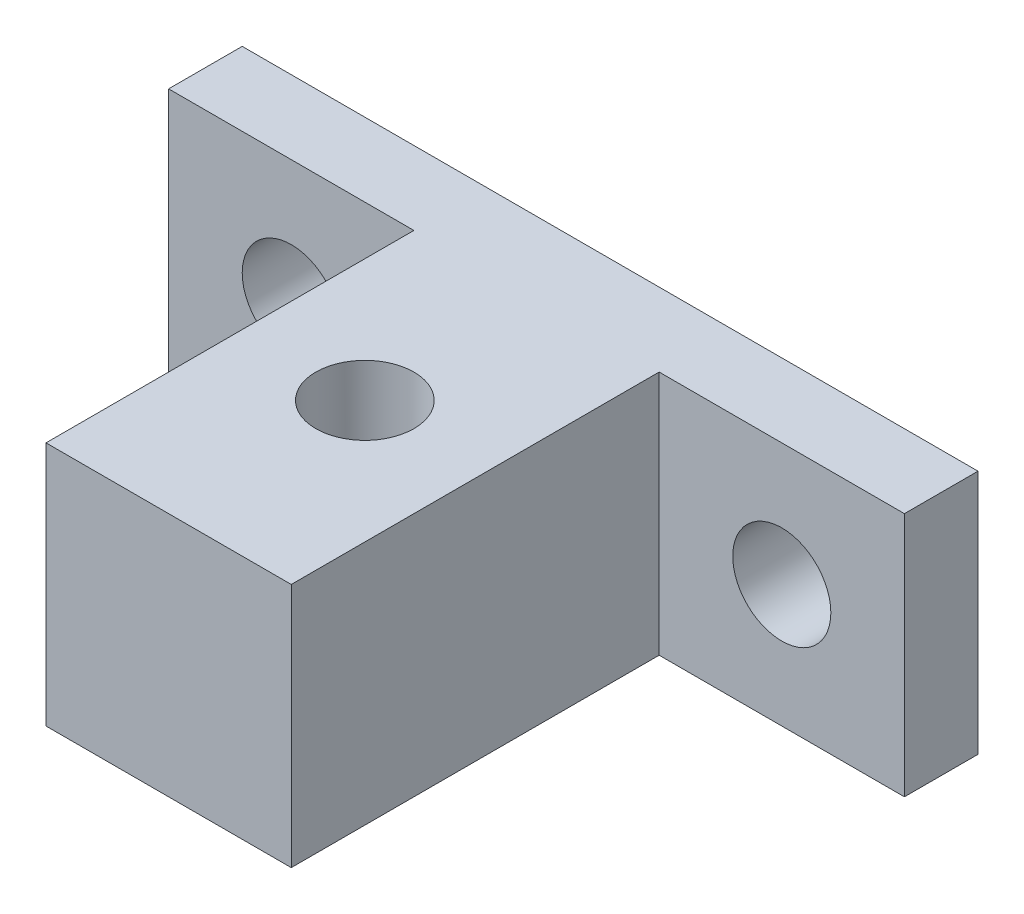
ISO-10303-21;
HEADER;
FILE_DESCRIPTION(('STEP AP214'),'2;1');
FILE_NAME('part.step','',(''),(''),'','','');
FILE_SCHEMA(('AUTOMOTIVE_DESIGN { 1 0 10303 214 1 1 1 1 }'));
ENDSEC;
DATA;
#1=APPLICATION_CONTEXT('core data for automotive mechanical design processes');
#2=APPLICATION_PROTOCOL_DEFINITION('international standard','automotive_design',2000,#1);
#3=PRODUCT_CONTEXT('',#1,'mechanical');
#4=PRODUCT('Part','Part','',(#3));
#5=PRODUCT_RELATED_PRODUCT_CATEGORY('part','',(#4));
#6=PRODUCT_DEFINITION_FORMATION('','',#4);
#7=PRODUCT_DEFINITION_CONTEXT('part definition',#1,'design');
#8=PRODUCT_DEFINITION('design','',#6,#7);
#9=PRODUCT_DEFINITION_SHAPE('','',#8);
#10=(LENGTH_UNIT() NAMED_UNIT(*) SI_UNIT(.MILLI.,.METRE.));
#11=(NAMED_UNIT(*) PLANE_ANGLE_UNIT() SI_UNIT($,.RADIAN.));
#12=(NAMED_UNIT(*) SI_UNIT($,.STERADIAN.) SOLID_ANGLE_UNIT());
#13=UNCERTAINTY_MEASURE_WITH_UNIT(LENGTH_MEASURE(1.E-05),#10,'distance_accuracy_value','');
#14=(GEOMETRIC_REPRESENTATION_CONTEXT(3) GLOBAL_UNCERTAINTY_ASSIGNED_CONTEXT((#13)) GLOBAL_UNIT_ASSIGNED_CONTEXT((#10,
#11,#12)) REPRESENTATION_CONTEXT('',''));
#15=CARTESIAN_POINT('',(0.,0.,0.));
#16=DIRECTION('',(0.,0.,1.));
#17=DIRECTION('',(1.,0.,0.));
#18=AXIS2_PLACEMENT_3D('',#15,#16,#17);
#19=CARTESIAN_POINT('',(0.,0.,3.));
#20=DIRECTION('',(0.,0.,-1.));
#21=DIRECTION('',(-1.,0.,0.));
#22=AXIS2_PLACEMENT_3D('',#19,#20,#21);
#23=PLANE('',#22);
#24=CARTESIAN_POINT('',(20.,-8.30000000000009,3.));
#25=DIRECTION('',(0.,0.,1.));
#26=DIRECTION('',(1.,0.,0.));
#27=AXIS2_PLACEMENT_3D('',#24,#25,#26);
#28=CIRCLE('',#27,2.);
#29=CARTESIAN_POINT('',(22.,-8.30000000000009,3.));
#30=VERTEX_POINT('',#29);
#31=EDGE_CURVE('E195',#30,#30,#28,.T.);
#32=ORIENTED_EDGE('',*,*,#31,.F.);
#33=EDGE_LOOP('',(#32));
#34=FACE_BOUND('',#33,.T.);
#35=DIRECTION('',(0.,1.,0.));
#36=VECTOR('',#35,1.);
#37=CARTESIAN_POINT('',(15.,-3.30000000000009,3.));
#38=LINE('',#37,#36);
#39=CARTESIAN_POINT('',(15.,-13.3000000000001,3.));
#40=VERTEX_POINT('',#39);
#41=CARTESIAN_POINT('',(15.,-3.30000000000009,3.));
#42=VERTEX_POINT('',#41);
#43=EDGE_CURVE('E57',#40,#42,#38,.T.);
#44=ORIENTED_EDGE('',*,*,#43,.F.);
#45=DIRECTION('',(1.,0.,0.));
#46=VECTOR('',#45,1.);
#47=CARTESIAN_POINT('',(25.,-13.3000000000001,3.));
#48=LINE('',#47,#46);
#49=CARTESIAN_POINT('',(25.,-13.3000000000001,3.));
#50=VERTEX_POINT('',#49);
#51=EDGE_CURVE('E210',#40,#50,#48,.T.);
#52=ORIENTED_EDGE('',*,*,#51,.T.);
#53=DIRECTION('',(0.,1.,0.));
#54=VECTOR('',#53,1.);
#55=CARTESIAN_POINT('',(25.,-3.30000000000009,3.));
#56=LINE('',#55,#54);
#57=CARTESIAN_POINT('',(25.,-3.30000000000009,3.));
#58=VERTEX_POINT('',#57);
#59=EDGE_CURVE('E201',#50,#58,#56,.T.);
#60=ORIENTED_EDGE('',*,*,#59,.T.);
#61=DIRECTION('',(-1.,0.,0.));
#62=VECTOR('',#61,1.);
#63=CARTESIAN_POINT('',(25.,-3.30000000000009,3.));
#64=LINE('',#63,#62);
#65=EDGE_CURVE('E206',#58,#42,#64,.T.);
#66=ORIENTED_EDGE('',*,*,#65,.T.);
#67=EDGE_LOOP('',(#44,#52,#60,#66));
#68=FACE_BOUND('',#67,.T.);
#69=ADVANCED_FACE('F34',(#34,#68),#23,.F.);
#70=CARTESIAN_POINT('',(0.,-8.30000000000009,3.));
#71=DIRECTION('',(0.,0.,1.));
#72=DIRECTION('',(-1.,0.,0.));
#73=AXIS2_PLACEMENT_3D('',#70,#71,#72);
#74=CIRCLE('',#73,2.);
#75=CARTESIAN_POINT('',(-2.,-8.30000000000009,3.));
#76=VERTEX_POINT('',#75);
#77=EDGE_CURVE('E189',#76,#76,#74,.T.);
#78=ORIENTED_EDGE('',*,*,#77,.F.);
#79=EDGE_LOOP('',(#78));
#80=FACE_BOUND('',#79,.T.);
#81=DIRECTION('',(0.,-1.,0.));
#82=VECTOR('',#81,1.);
#83=CARTESIAN_POINT('',(5.,-3.30000000000009,3.));
#84=LINE('',#83,#82);
#85=CARTESIAN_POINT('',(5.,-3.30000000000009,3.));
#86=VERTEX_POINT('',#85);
#87=CARTESIAN_POINT('',(5.00000000000001,-13.3000000000001,3.));
#88=VERTEX_POINT('',#87);
#89=EDGE_CURVE('E159',#86,#88,#84,.T.);
#90=ORIENTED_EDGE('',*,*,#89,.F.);
#91=CARTESIAN_POINT('',(-5.,-3.30000000000009,3.));
#92=VERTEX_POINT('',#91);
#93=EDGE_CURVE('E204',#86,#92,#64,.T.);
#94=ORIENTED_EDGE('',*,*,#93,.T.);
#95=DIRECTION('',(0.,-1.,0.));
#96=VECTOR('',#95,1.);
#97=CARTESIAN_POINT('',(-5.,-3.30000000000009,3.));
#98=LINE('',#97,#96);
#99=CARTESIAN_POINT('',(-5.,-13.3000000000001,3.));
#100=VERTEX_POINT('',#99);
#101=EDGE_CURVE('E208',#92,#100,#98,.T.);
#102=ORIENTED_EDGE('',*,*,#101,.T.);
#103=EDGE_CURVE('E211',#100,#88,#48,.T.);
#104=ORIENTED_EDGE('',*,*,#103,.T.);
#105=EDGE_LOOP('',(#90,#94,#102,#104));
#106=FACE_BOUND('',#105,.T.);
#107=ADVANCED_FACE('F260',(#80,#106),#23,.F.);
#108=CARTESIAN_POINT('',(0.,0.,0.));
#109=DIRECTION('',(0.,0.,-1.));
#110=DIRECTION('',(-1.,0.,0.));
#111=AXIS2_PLACEMENT_3D('',#108,#109,#110);
#112=PLANE('',#111);
#113=CARTESIAN_POINT('',(20.,-8.30000000000009,0.));
#114=DIRECTION('',(0.,0.,1.));
#115=DIRECTION('',(1.,0.,0.));
#116=AXIS2_PLACEMENT_3D('',#113,#114,#115);
#117=CIRCLE('',#116,2.);
#118=CARTESIAN_POINT('',(22.,-8.30000000000009,0.));
#119=VERTEX_POINT('',#118);
#120=EDGE_CURVE('E192',#119,#119,#117,.T.);
#121=ORIENTED_EDGE('',*,*,#120,.T.);
#122=EDGE_LOOP('',(#121));
#123=FACE_BOUND('',#122,.T.);
#124=DIRECTION('',(0.,1.,0.));
#125=VECTOR('',#124,1.);
#126=CARTESIAN_POINT('',(25.,-3.30000000000009,0.));
#127=LINE('',#126,#125);
#128=CARTESIAN_POINT('',(25.,-13.3000000000001,0.));
#129=VERTEX_POINT('',#128);
#130=CARTESIAN_POINT('',(25.,-3.30000000000009,0.));
#131=VERTEX_POINT('',#130);
#132=EDGE_CURVE('E198',#129,#131,#127,.T.);
#133=ORIENTED_EDGE('',*,*,#132,.F.);
#134=DIRECTION('',(1.,0.,0.));
#135=VECTOR('',#134,1.);
#136=CARTESIAN_POINT('',(25.,-13.3000000000001,0.));
#137=LINE('',#136,#135);
#138=CARTESIAN_POINT('',(-5.,-13.3000000000001,0.));
#139=VERTEX_POINT('',#138);
#140=EDGE_CURVE('E205',#139,#129,#137,.T.);
#141=ORIENTED_EDGE('',*,*,#140,.F.);
#142=DIRECTION('',(0.,-1.,0.));
#143=VECTOR('',#142,1.);
#144=CARTESIAN_POINT('',(-5.,-3.30000000000009,0.));
#145=LINE('',#144,#143);
#146=CARTESIAN_POINT('',(-5.,-3.30000000000009,0.));
#147=VERTEX_POINT('',#146);
#148=EDGE_CURVE('E218',#147,#139,#145,.T.);
#149=ORIENTED_EDGE('',*,*,#148,.F.);
#150=DIRECTION('',(-1.,0.,0.));
#151=VECTOR('',#150,1.);
#152=CARTESIAN_POINT('',(25.,-3.30000000000009,0.));
#153=LINE('',#152,#151);
#154=EDGE_CURVE('E216',#131,#147,#153,.T.);
#155=ORIENTED_EDGE('',*,*,#154,.F.);
#156=EDGE_LOOP('',(#133,#141,#149,#155));
#157=FACE_BOUND('',#156,.T.);
#158=CARTESIAN_POINT('',(0.,-8.30000000000009,0.));
#159=DIRECTION('',(0.,0.,1.));
#160=DIRECTION('',(-1.,0.,0.));
#161=AXIS2_PLACEMENT_3D('',#158,#159,#160);
#162=CIRCLE('',#161,2.);
#163=CARTESIAN_POINT('',(-2.,-8.30000000000009,0.));
#164=VERTEX_POINT('',#163);
#165=EDGE_CURVE('E188',#164,#164,#162,.T.);
#166=ORIENTED_EDGE('',*,*,#165,.T.);
#167=EDGE_LOOP('',(#166));
#168=FACE_BOUND('',#167,.T.);
#169=ADVANCED_FACE('F237',(#123,#157,#168),#112,.T.);
#170=CARTESIAN_POINT('',(25.,-3.30000000000009,3.));
#171=DIRECTION('',(-1.,0.,0.));
#172=DIRECTION('',(0.,0.,1.));
#173=AXIS2_PLACEMENT_3D('',#170,#171,#172);
#174=PLANE('',#173);
#175=ORIENTED_EDGE('',*,*,#132,.T.);
#176=DIRECTION('',(0.,0.,-1.));
#177=VECTOR('',#176,1.);
#178=CARTESIAN_POINT('',(25.,-3.30000000000009,3.));
#179=LINE('',#178,#177);
#180=EDGE_CURVE('E11',#58,#131,#179,.T.);
#181=ORIENTED_EDGE('',*,*,#180,.F.);
#182=ORIENTED_EDGE('',*,*,#59,.F.);
#183=DIRECTION('',(0.,0.,-1.));
#184=VECTOR('',#183,1.);
#185=CARTESIAN_POINT('',(25.,-13.3000000000001,3.));
#186=LINE('',#185,#184);
#187=EDGE_CURVE('E213',#50,#129,#186,.T.);
#188=ORIENTED_EDGE('',*,*,#187,.T.);
#189=EDGE_LOOP('',(#175,#181,#182,#188));
#190=FACE_BOUND('',#189,.T.);
#191=ADVANCED_FACE('F36',(#190),#174,.F.);
#192=CARTESIAN_POINT('',(25.,-3.30000000000009,3.));
#193=DIRECTION('',(0.,-1.,0.));
#194=DIRECTION('',(0.,0.,-1.));
#195=AXIS2_PLACEMENT_3D('',#192,#193,#194);
#196=PLANE('',#195);
#197=CARTESIAN_POINT('',(10.,-3.30000000000009,10.));
#198=DIRECTION('',(0.,-1.,0.));
#199=DIRECTION('',(0.,0.,-1.));
#200=AXIS2_PLACEMENT_3D('',#197,#198,#199);
#201=CIRCLE('',#200,2.);
#202=CARTESIAN_POINT('',(10.,-3.30000000000009,8.));
#203=VERTEX_POINT('',#202);
#204=EDGE_CURVE('E296',#203,#203,#201,.T.);
#205=ORIENTED_EDGE('',*,*,#204,.T.);
#206=EDGE_LOOP('',(#205));
#207=FACE_BOUND('',#206,.T.);
#208=ORIENTED_EDGE('',*,*,#154,.T.);
#209=DIRECTION('',(0.,0.,-1.));
#210=VECTOR('',#209,1.);
#211=CARTESIAN_POINT('',(-5.,-3.30000000000009,3.));
#212=LINE('',#211,#210);
#213=EDGE_CURVE('E42',#92,#147,#212,.T.);
#214=ORIENTED_EDGE('',*,*,#213,.F.);
#215=ORIENTED_EDGE('',*,*,#93,.F.);
#216=DIRECTION('',(0.,0.,-1.));
#217=VECTOR('',#216,1.);
#218=CARTESIAN_POINT('',(5.,-3.30000000000009,18.));
#219=LINE('',#218,#217);
#220=CARTESIAN_POINT('',(5.,-3.30000000000009,18.));
#221=VERTEX_POINT('',#220);
#222=EDGE_CURVE('E182',#221,#86,#219,.T.);
#223=ORIENTED_EDGE('',*,*,#222,.F.);
#224=DIRECTION('',(-1.,0.,0.));
#225=VECTOR('',#224,1.);
#226=CARTESIAN_POINT('',(15.,-3.30000000000009,18.));
#227=LINE('',#226,#225);
#228=CARTESIAN_POINT('',(15.,-3.30000000000009,18.));
#229=VERTEX_POINT('',#228);
#230=EDGE_CURVE('E168',#229,#221,#227,.T.);
#231=ORIENTED_EDGE('',*,*,#230,.F.);
#232=DIRECTION('',(0.,0.,-1.));
#233=VECTOR('',#232,1.);
#234=CARTESIAN_POINT('',(15.,-3.30000000000009,18.));
#235=LINE('',#234,#233);
#236=EDGE_CURVE('E185',#229,#42,#235,.T.);
#237=ORIENTED_EDGE('',*,*,#236,.T.);
#238=ORIENTED_EDGE('',*,*,#65,.F.);
#239=ORIENTED_EDGE('',*,*,#180,.T.);
#240=EDGE_LOOP('',(#208,#214,#215,#223,#231,#237,#238,#239));
#241=FACE_BOUND('',#240,.T.);
#242=ADVANCED_FACE('F261',(#207,#241),#196,.F.);
#243=CARTESIAN_POINT('',(-5.,-3.30000000000009,3.));
#244=DIRECTION('',(1.,0.,0.));
#245=DIRECTION('',(0.,0.,-1.));
#246=AXIS2_PLACEMENT_3D('',#243,#244,#245);
#247=PLANE('',#246);
#248=ORIENTED_EDGE('',*,*,#148,.T.);
#249=DIRECTION('',(0.,0.,-1.));
#250=VECTOR('',#249,1.);
#251=CARTESIAN_POINT('',(-5.,-13.3000000000001,3.));
#252=LINE('',#251,#250);
#253=EDGE_CURVE('E223',#100,#139,#252,.T.);
#254=ORIENTED_EDGE('',*,*,#253,.F.);
#255=ORIENTED_EDGE('',*,*,#101,.F.);
#256=ORIENTED_EDGE('',*,*,#213,.T.);
#257=EDGE_LOOP('',(#248,#254,#255,#256));
#258=FACE_BOUND('',#257,.T.);
#259=ADVANCED_FACE('F230',(#258),#247,.F.);
#260=CARTESIAN_POINT('',(25.,-13.3000000000001,3.));
#261=DIRECTION('',(0.,1.,0.));
#262=DIRECTION('',(0.,0.,1.));
#263=AXIS2_PLACEMENT_3D('',#260,#261,#262);
#264=PLANE('',#263);
#265=DIRECTION('',(-0.866025403784439,0.,-0.5));
#266=VECTOR('',#265,1.);
#267=CARTESIAN_POINT('',(19.9189110867545,-13.3000000000001,11.8007041555162));
#268=LINE('',#267,#266);
#269=CARTESIAN_POINT('',(13.4,-13.3000000000001,8.03700908475527));
#270=VERTEX_POINT('',#269);
#271=CARTESIAN_POINT('',(10.,-13.3000000000001,6.07401816951054));
#272=VERTEX_POINT('',#271);
#273=EDGE_CURVE('E49',#270,#272,#268,.T.);
#274=ORIENTED_EDGE('',*,*,#273,.T.);
#275=DIRECTION('',(-0.866025403784439,0.,0.5));
#276=VECTOR('',#275,1.);
#277=CARTESIAN_POINT('',(22.5810889132455,-13.3000000000001,-1.18967690125038));
#278=LINE('',#277,#276);
#279=CARTESIAN_POINT('',(6.60000000000001,-13.3000000000001,8.03700908475527));
#280=VERTEX_POINT('',#279);
#281=EDGE_CURVE('E156',#272,#280,#278,.T.);
#282=ORIENTED_EDGE('',*,*,#281,.T.);
#283=DIRECTION('',(0.,0.,1.));
#284=VECTOR('',#283,1.);
#285=CARTESIAN_POINT('',(6.60000000000001,-13.3000000000001,3.));
#286=LINE('',#285,#284);
#287=CARTESIAN_POINT('',(6.60000000000001,-13.3000000000001,11.9629909152447));
#288=VERTEX_POINT('',#287);
#289=EDGE_CURVE('E298',#280,#288,#286,.T.);
#290=ORIENTED_EDGE('',*,*,#289,.T.);
#291=DIRECTION('',(0.866025403784439,0.,0.5));
#292=VECTOR('',#291,1.);
#293=CARTESIAN_POINT('',(16.5189110867545,-13.3000000000001,17.6896769012504));
#294=LINE('',#293,#292);
#295=CARTESIAN_POINT('',(10.,-13.3000000000001,13.9259818304895));
#296=VERTEX_POINT('',#295);
#297=EDGE_CURVE('E307',#288,#296,#294,.T.);
#298=ORIENTED_EDGE('',*,*,#297,.T.);
#299=DIRECTION('',(0.866025403784439,0.,-0.5));
#300=VECTOR('',#299,1.);
#301=CARTESIAN_POINT('',(25.9810889132455,-13.3000000000001,4.69929584448381));
#302=LINE('',#301,#300);
#303=CARTESIAN_POINT('',(13.4,-13.3000000000001,11.9629909152447));
#304=VERTEX_POINT('',#303);
#305=EDGE_CURVE('E310',#296,#304,#302,.T.);
#306=ORIENTED_EDGE('',*,*,#305,.T.);
#307=DIRECTION('',(0.,0.,-1.));
#308=VECTOR('',#307,1.);
#309=CARTESIAN_POINT('',(13.4,-13.3000000000001,3.));
#310=LINE('',#309,#308);
#311=EDGE_CURVE('E152',#304,#270,#310,.T.);
#312=ORIENTED_EDGE('',*,*,#311,.T.);
#313=EDGE_LOOP('',(#274,#282,#290,#298,#306,#312));
#314=FACE_BOUND('',#313,.T.);
#315=ORIENTED_EDGE('',*,*,#140,.T.);
#316=ORIENTED_EDGE('',*,*,#187,.F.);
#317=ORIENTED_EDGE('',*,*,#51,.F.);
#318=DIRECTION('',(0.,0.,-1.));
#319=VECTOR('',#318,1.);
#320=CARTESIAN_POINT('',(15.,-13.3000000000001,18.));
#321=LINE('',#320,#319);
#322=CARTESIAN_POINT('',(15.,-13.3000000000001,18.));
#323=VERTEX_POINT('',#322);
#324=EDGE_CURVE('E173',#323,#40,#321,.T.);
#325=ORIENTED_EDGE('',*,*,#324,.F.);
#326=DIRECTION('',(1.,0.,0.));
#327=VECTOR('',#326,1.);
#328=CARTESIAN_POINT('',(15.,-13.3000000000001,18.));
#329=LINE('',#328,#327);
#330=CARTESIAN_POINT('',(5.00000000000001,-13.3000000000001,18.));
#331=VERTEX_POINT('',#330);
#332=EDGE_CURVE('E172',#331,#323,#329,.T.);
#333=ORIENTED_EDGE('',*,*,#332,.F.);
#334=DIRECTION('',(0.,0.,-1.));
#335=VECTOR('',#334,1.);
#336=CARTESIAN_POINT('',(5.00000000000001,-13.3000000000001,18.));
#337=LINE('',#336,#335);
#338=EDGE_CURVE('E179',#331,#88,#337,.T.);
#339=ORIENTED_EDGE('',*,*,#338,.T.);
#340=ORIENTED_EDGE('',*,*,#103,.F.);
#341=ORIENTED_EDGE('',*,*,#253,.T.);
#342=EDGE_LOOP('',(#315,#316,#317,#325,#333,#339,#340,#341));
#343=FACE_BOUND('',#342,.T.);
#344=ADVANCED_FACE('F241',(#314,#343),#264,.F.);
#345=CARTESIAN_POINT('',(20.,-8.30000000000009,3.));
#346=DIRECTION('',(0.,0.,-1.));
#347=DIRECTION('',(-1.,0.,0.));
#348=AXIS2_PLACEMENT_3D('',#345,#346,#347);
#349=CYLINDRICAL_SURFACE('',#348,2.);
#350=ORIENTED_EDGE('',*,*,#31,.T.);
#351=EDGE_LOOP('',(#350));
#352=FACE_BOUND('',#351,.T.);
#353=ORIENTED_EDGE('',*,*,#120,.F.);
#354=EDGE_LOOP('',(#353));
#355=FACE_BOUND('',#354,.T.);
#356=ADVANCED_FACE('F280',(#352,#355),#349,.F.);
#357=CARTESIAN_POINT('',(0.,-8.30000000000009,3.));
#358=DIRECTION('',(0.,0.,-1.));
#359=DIRECTION('',(-1.,0.,0.));
#360=AXIS2_PLACEMENT_3D('',#357,#358,#359);
#361=CYLINDRICAL_SURFACE('',#360,2.);
#362=ORIENTED_EDGE('',*,*,#77,.T.);
#363=EDGE_LOOP('',(#362));
#364=FACE_BOUND('',#363,.T.);
#365=ORIENTED_EDGE('',*,*,#165,.F.);
#366=EDGE_LOOP('',(#365));
#367=FACE_BOUND('',#366,.T.);
#368=ADVANCED_FACE('F290',(#364,#367),#361,.F.);
#369=CARTESIAN_POINT('',(15.,-3.30000000000009,18.));
#370=DIRECTION('',(-1.,0.,0.));
#371=DIRECTION('',(0.,-1.,0.));
#372=AXIS2_PLACEMENT_3D('',#369,#370,#371);
#373=PLANE('',#372);
#374=ORIENTED_EDGE('',*,*,#43,.T.);
#375=ORIENTED_EDGE('',*,*,#236,.F.);
#376=DIRECTION('',(0.,1.,0.));
#377=VECTOR('',#376,1.);
#378=CARTESIAN_POINT('',(15.,-3.30000000000009,18.));
#379=LINE('',#378,#377);
#380=EDGE_CURVE('E165',#323,#229,#379,.T.);
#381=ORIENTED_EDGE('',*,*,#380,.F.);
#382=ORIENTED_EDGE('',*,*,#324,.T.);
#383=EDGE_LOOP('',(#374,#375,#381,#382));
#384=FACE_BOUND('',#383,.T.);
#385=ADVANCED_FACE('F250',(#384),#373,.F.);
#386=CARTESIAN_POINT('',(5.,-3.30000000000009,18.));
#387=DIRECTION('',(1.,0.,0.));
#388=DIRECTION('',(0.,1.,0.));
#389=AXIS2_PLACEMENT_3D('',#386,#387,#388);
#390=PLANE('',#389);
#391=ORIENTED_EDGE('',*,*,#89,.T.);
#392=ORIENTED_EDGE('',*,*,#338,.F.);
#393=DIRECTION('',(0.,-1.,0.));
#394=VECTOR('',#393,1.);
#395=CARTESIAN_POINT('',(5.,-3.30000000000009,18.));
#396=LINE('',#395,#394);
#397=EDGE_CURVE('E170',#221,#331,#396,.T.);
#398=ORIENTED_EDGE('',*,*,#397,.F.);
#399=ORIENTED_EDGE('',*,*,#222,.T.);
#400=EDGE_LOOP('',(#391,#392,#398,#399));
#401=FACE_BOUND('',#400,.T.);
#402=ADVANCED_FACE('F258',(#401),#390,.F.);
#403=CARTESIAN_POINT('',(0.,0.,18.));
#404=DIRECTION('',(0.,0.,-1.));
#405=DIRECTION('',(-1.,0.,0.));
#406=AXIS2_PLACEMENT_3D('',#403,#404,#405);
#407=PLANE('',#406);
#408=ORIENTED_EDGE('',*,*,#380,.T.);
#409=ORIENTED_EDGE('',*,*,#230,.T.);
#410=ORIENTED_EDGE('',*,*,#397,.T.);
#411=ORIENTED_EDGE('',*,*,#332,.T.);
#412=EDGE_LOOP('',(#408,#409,#410,#411));
#413=FACE_BOUND('',#412,.T.);
#414=ADVANCED_FACE('F253',(#413),#407,.F.);
#415=CARTESIAN_POINT('',(0.,-8.30000000000009,0.));
#416=DIRECTION('',(0.,1.,0.));
#417=DIRECTION('',(0.,0.,1.));
#418=AXIS2_PLACEMENT_3D('',#415,#416,#417);
#419=PLANE('',#418);
#420=DIRECTION('',(-0.866025403784439,0.,-0.5));
#421=VECTOR('',#420,1.);
#422=CARTESIAN_POINT('',(19.9189110867545,-8.30000000000009,11.8007041555162));
#423=LINE('',#422,#421);
#424=CARTESIAN_POINT('',(13.4,-8.30000000000009,8.03700908475527));
#425=VERTEX_POINT('',#424);
#426=CARTESIAN_POINT('',(10.,-8.30000000000009,6.07401816951054));
#427=VERTEX_POINT('',#426);
#428=EDGE_CURVE('E142',#425,#427,#423,.T.);
#429=ORIENTED_EDGE('',*,*,#428,.F.);
#430=DIRECTION('',(0.,0.,-1.));
#431=VECTOR('',#430,1.);
#432=CARTESIAN_POINT('',(13.4,-8.30000000000009,3.));
#433=LINE('',#432,#431);
#434=CARTESIAN_POINT('',(13.4,-8.30000000000009,11.9629909152447));
#435=VERTEX_POINT('',#434);
#436=EDGE_CURVE('E303',#435,#425,#433,.T.);
#437=ORIENTED_EDGE('',*,*,#436,.F.);
#438=DIRECTION('',(0.866025403784439,0.,-0.5));
#439=VECTOR('',#438,1.);
#440=CARTESIAN_POINT('',(25.9810889132455,-8.30000000000009,4.69929584448381));
#441=LINE('',#440,#439);
#442=CARTESIAN_POINT('',(10.,-8.30000000000009,13.9259818304895));
#443=VERTEX_POINT('',#442);
#444=EDGE_CURVE('E330',#443,#435,#441,.T.);
#445=ORIENTED_EDGE('',*,*,#444,.F.);
#446=DIRECTION('',(0.866025403784439,0.,0.5));
#447=VECTOR('',#446,1.);
#448=CARTESIAN_POINT('',(16.5189110867545,-8.30000000000009,17.6896769012504));
#449=LINE('',#448,#447);
#450=CARTESIAN_POINT('',(6.60000000000001,-8.30000000000009,11.9629909152447));
#451=VERTEX_POINT('',#450);
#452=EDGE_CURVE('E333',#451,#443,#449,.T.);
#453=ORIENTED_EDGE('',*,*,#452,.F.);
#454=DIRECTION('',(0.,0.,1.));
#455=VECTOR('',#454,1.);
#456=CARTESIAN_POINT('',(6.60000000000001,-8.30000000000009,3.));
#457=LINE('',#456,#455);
#458=CARTESIAN_POINT('',(6.60000000000001,-8.30000000000009,8.03700908475527));
#459=VERTEX_POINT('',#458);
#460=EDGE_CURVE('E144',#459,#451,#457,.T.);
#461=ORIENTED_EDGE('',*,*,#460,.F.);
#462=DIRECTION('',(-0.866025403784439,0.,0.5));
#463=VECTOR('',#462,1.);
#464=CARTESIAN_POINT('',(22.5810889132455,-8.30000000000009,-1.18967690125038));
#465=LINE('',#464,#463);
#466=EDGE_CURVE('E137',#427,#459,#465,.T.);
#467=ORIENTED_EDGE('',*,*,#466,.F.);
#468=EDGE_LOOP('',(#429,#437,#445,#453,#461,#467));
#469=FACE_BOUND('',#468,.T.);
#470=CARTESIAN_POINT('',(10.,-8.30000000000009,10.));
#471=DIRECTION('',(0.,1.,0.));
#472=DIRECTION('',(0.,0.,1.));
#473=AXIS2_PLACEMENT_3D('',#470,#471,#472);
#474=CIRCLE('',#473,2.);
#475=CARTESIAN_POINT('',(10.,-8.30000000000009,12.));
#476=VERTEX_POINT('',#475);
#477=EDGE_CURVE('E300',#476,#476,#474,.T.);
#478=ORIENTED_EDGE('',*,*,#477,.T.);
#479=EDGE_LOOP('',(#478));
#480=FACE_BOUND('',#479,.T.);
#481=ADVANCED_FACE('F139',(#469,#480),#419,.F.);
#482=CARTESIAN_POINT('',(19.9189110867545,-8.30000000000009,11.8007041555162));
#483=DIRECTION('',(-0.5,0.,0.866025403784439));
#484=DIRECTION('',(0.866025403784439,0.,0.5));
#485=AXIS2_PLACEMENT_3D('',#482,#483,#484);
#486=PLANE('',#485);
#487=ORIENTED_EDGE('',*,*,#273,.F.);
#488=DIRECTION('',(0.,-1.,0.));
#489=VECTOR('',#488,1.);
#490=CARTESIAN_POINT('',(13.4,-8.30000000000009,8.03700908475527));
#491=LINE('',#490,#489);
#492=EDGE_CURVE('E151',#425,#270,#491,.T.);
#493=ORIENTED_EDGE('',*,*,#492,.F.);
#494=ORIENTED_EDGE('',*,*,#428,.T.);
#495=DIRECTION('',(0.,-1.,0.));
#496=VECTOR('',#495,1.);
#497=CARTESIAN_POINT('',(10.,-8.30000000000009,6.07401816951054));
#498=LINE('',#497,#496);
#499=EDGE_CURVE('E150',#427,#272,#498,.T.);
#500=ORIENTED_EDGE('',*,*,#499,.T.);
#501=EDGE_LOOP('',(#487,#493,#494,#500));
#502=FACE_BOUND('',#501,.T.);
#503=ADVANCED_FACE('F149',(#502),#486,.T.);
#504=CARTESIAN_POINT('',(22.5810889132455,-8.30000000000009,-1.18967690125038));
#505=DIRECTION('',(0.5,0.,0.866025403784439));
#506=DIRECTION('',(0.866025403784439,0.,-0.5));
#507=AXIS2_PLACEMENT_3D('',#504,#505,#506);
#508=PLANE('',#507);
#509=ORIENTED_EDGE('',*,*,#281,.F.);
#510=ORIENTED_EDGE('',*,*,#499,.F.);
#511=ORIENTED_EDGE('',*,*,#466,.T.);
#512=DIRECTION('',(0.,-1.,0.));
#513=VECTOR('',#512,1.);
#514=CARTESIAN_POINT('',(6.60000000000001,-8.30000000000009,8.03700908475527));
#515=LINE('',#514,#513);
#516=EDGE_CURVE('E157',#459,#280,#515,.T.);
#517=ORIENTED_EDGE('',*,*,#516,.T.);
#518=EDGE_LOOP('',(#509,#510,#511,#517));
#519=FACE_BOUND('',#518,.T.);
#520=ADVANCED_FACE('F154',(#519),#508,.T.);
#521=CARTESIAN_POINT('',(6.60000000000001,-8.30000000000009,3.));
#522=DIRECTION('',(1.,0.,0.));
#523=DIRECTION('',(0.,0.,-1.));
#524=AXIS2_PLACEMENT_3D('',#521,#522,#523);
#525=PLANE('',#524);
#526=ORIENTED_EDGE('',*,*,#289,.F.);
#527=ORIENTED_EDGE('',*,*,#516,.F.);
#528=ORIENTED_EDGE('',*,*,#460,.T.);
#529=DIRECTION('',(0.,-1.,0.));
#530=VECTOR('',#529,1.);
#531=CARTESIAN_POINT('',(6.60000000000001,-8.30000000000009,11.9629909152447));
#532=LINE('',#531,#530);
#533=EDGE_CURVE('E161',#451,#288,#532,.T.);
#534=ORIENTED_EDGE('',*,*,#533,.T.);
#535=EDGE_LOOP('',(#526,#527,#528,#534));
#536=FACE_BOUND('',#535,.T.);
#537=ADVANCED_FACE('F321',(#536),#525,.T.);
#538=CARTESIAN_POINT('',(16.5189110867545,-8.30000000000009,17.6896769012504));
#539=DIRECTION('',(0.5,0.,-0.866025403784439));
#540=DIRECTION('',(-0.866025403784439,0.,-0.5));
#541=AXIS2_PLACEMENT_3D('',#538,#539,#540);
#542=PLANE('',#541);
#543=ORIENTED_EDGE('',*,*,#297,.F.);
#544=ORIENTED_EDGE('',*,*,#533,.F.);
#545=ORIENTED_EDGE('',*,*,#452,.T.);
#546=DIRECTION('',(0.,-1.,0.));
#547=VECTOR('',#546,1.);
#548=CARTESIAN_POINT('',(10.,-8.30000000000009,13.9259818304895));
#549=LINE('',#548,#547);
#550=EDGE_CURVE('E316',#443,#296,#549,.T.);
#551=ORIENTED_EDGE('',*,*,#550,.T.);
#552=EDGE_LOOP('',(#543,#544,#545,#551));
#553=FACE_BOUND('',#552,.T.);
#554=ADVANCED_FACE('F323',(#553),#542,.T.);
#555=CARTESIAN_POINT('',(25.9810889132455,-8.30000000000009,4.69929584448381));
#556=DIRECTION('',(-0.5,0.,-0.866025403784439));
#557=DIRECTION('',(-0.866025403784439,0.,0.5));
#558=AXIS2_PLACEMENT_3D('',#555,#556,#557);
#559=PLANE('',#558);
#560=ORIENTED_EDGE('',*,*,#305,.F.);
#561=ORIENTED_EDGE('',*,*,#550,.F.);
#562=ORIENTED_EDGE('',*,*,#444,.T.);
#563=DIRECTION('',(0.,-1.,0.));
#564=VECTOR('',#563,1.);
#565=CARTESIAN_POINT('',(13.4,-8.30000000000009,11.9629909152447));
#566=LINE('',#565,#564);
#567=EDGE_CURVE('E314',#435,#304,#566,.T.);
#568=ORIENTED_EDGE('',*,*,#567,.T.);
#569=EDGE_LOOP('',(#560,#561,#562,#568));
#570=FACE_BOUND('',#569,.T.);
#571=ADVANCED_FACE('F327',(#570),#559,.T.);
#572=CARTESIAN_POINT('',(13.4,-8.30000000000009,3.));
#573=DIRECTION('',(-1.,0.,0.));
#574=DIRECTION('',(0.,0.,1.));
#575=AXIS2_PLACEMENT_3D('',#572,#573,#574);
#576=PLANE('',#575);
#577=ORIENTED_EDGE('',*,*,#311,.F.);
#578=ORIENTED_EDGE('',*,*,#567,.F.);
#579=ORIENTED_EDGE('',*,*,#436,.T.);
#580=ORIENTED_EDGE('',*,*,#492,.T.);
#581=EDGE_LOOP('',(#577,#578,#579,#580));
#582=FACE_BOUND('',#581,.T.);
#583=ADVANCED_FACE('F332',(#582),#576,.T.);
#584=CARTESIAN_POINT('',(10.,-13.3000000000001,10.));
#585=DIRECTION('',(0.,1.,0.));
#586=DIRECTION('',(0.,0.,1.));
#587=AXIS2_PLACEMENT_3D('',#584,#585,#586);
#588=CYLINDRICAL_SURFACE('',#587,2.);
#589=ORIENTED_EDGE('',*,*,#477,.F.);
#590=EDGE_LOOP('',(#589));
#591=FACE_BOUND('',#590,.T.);
#592=ORIENTED_EDGE('',*,*,#204,.F.);
#593=EDGE_LOOP('',(#592));
#594=FACE_BOUND('',#593,.T.);
#595=ADVANCED_FACE('F340',(#591,#594),#588,.F.);
#596=CLOSED_SHELL('',(#69,#107,#169,#191,#242,#259,#344,#356,#368,#385,#402,#414,#481,#503,#520,
#537,#554,#571,#583,#595));
#597=MANIFOLD_SOLID_BREP('B2',#596);
#598=ADVANCED_BREP_SHAPE_REPRESENTATION('',(#18,#597),#14);
#599=SHAPE_DEFINITION_REPRESENTATION(#9,#598);
ENDSEC;
END-ISO-10303-21;
